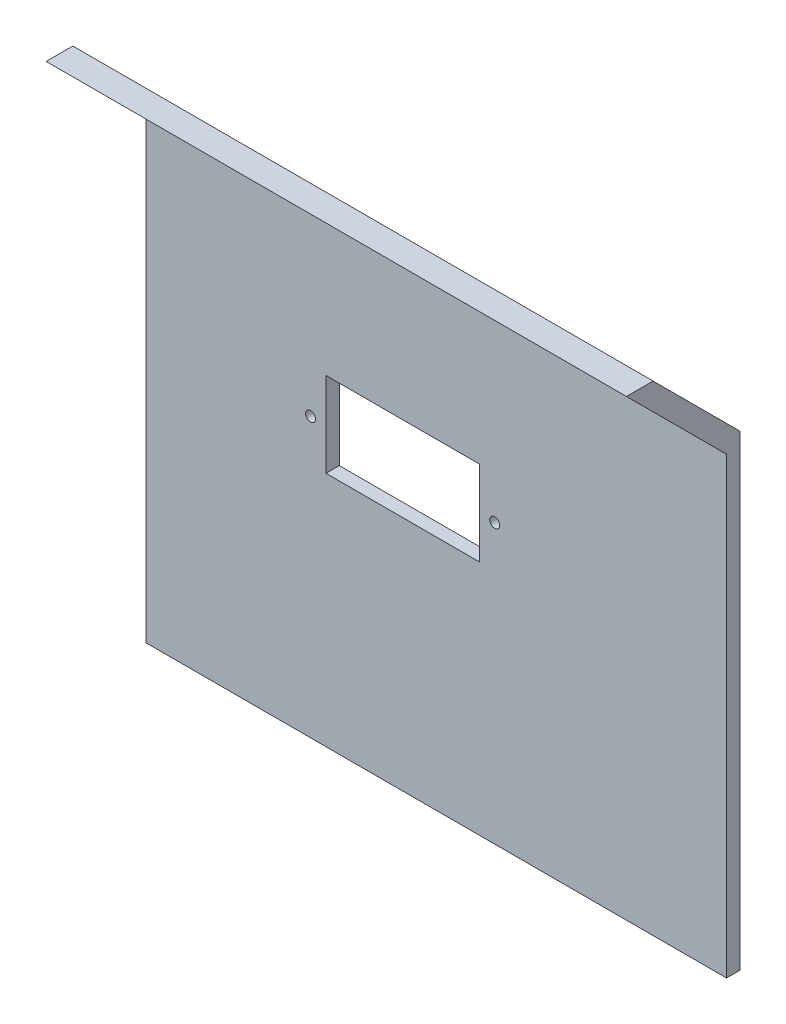
ISO-10303-21;
HEADER;
FILE_DESCRIPTION(('STEP AP214'),'2;1');
FILE_NAME('part.step','',(''),(''),'','','');
FILE_SCHEMA(('AUTOMOTIVE_DESIGN { 1 0 10303 214 1 1 1 1 }'));
ENDSEC;
DATA;
#1=APPLICATION_CONTEXT('core data for automotive mechanical design processes');
#2=APPLICATION_PROTOCOL_DEFINITION('international standard','automotive_design',2000,#1);
#3=PRODUCT_CONTEXT('',#1,'mechanical');
#4=PRODUCT('Part','Part','',(#3));
#5=PRODUCT_RELATED_PRODUCT_CATEGORY('part','',(#4));
#6=PRODUCT_DEFINITION_FORMATION('','',#4);
#7=PRODUCT_DEFINITION_CONTEXT('part definition',#1,'design');
#8=PRODUCT_DEFINITION('design','',#6,#7);
#9=PRODUCT_DEFINITION_SHAPE('','',#8);
#10=(LENGTH_UNIT() NAMED_UNIT(*) SI_UNIT(.MILLI.,.METRE.));
#11=(NAMED_UNIT(*) PLANE_ANGLE_UNIT() SI_UNIT($,.RADIAN.));
#12=(NAMED_UNIT(*) SI_UNIT($,.STERADIAN.) SOLID_ANGLE_UNIT());
#13=UNCERTAINTY_MEASURE_WITH_UNIT(LENGTH_MEASURE(1.E-05),#10,'distance_accuracy_value','');
#14=(GEOMETRIC_REPRESENTATION_CONTEXT(3) GLOBAL_UNCERTAINTY_ASSIGNED_CONTEXT((#13)) GLOBAL_UNIT_ASSIGNED_CONTEXT((#10,
#11,#12)) REPRESENTATION_CONTEXT('',''));
#15=CARTESIAN_POINT('',(0.,0.,0.));
#16=DIRECTION('',(0.,0.,1.));
#17=DIRECTION('',(1.,0.,0.));
#18=AXIS2_PLACEMENT_3D('',#15,#16,#17);
#19=CARTESIAN_POINT('',(-85.,-192.880838161877,2.));
#20=DIRECTION('',(1.,0.,0.));
#21=DIRECTION('',(0.,0.,-1.));
#22=AXIS2_PLACEMENT_3D('',#19,#20,#21);
#23=PLANE('',#22);
#24=DIRECTION('',(0.,-1.,0.));
#25=VECTOR('',#24,1.);
#26=CARTESIAN_POINT('',(-85.,-192.880838161877,2.));
#27=LINE('',#26,#25);
#28=CARTESIAN_POINT('',(-85.,-124.880838161877,2.));
#29=VERTEX_POINT('',#28);
#30=CARTESIAN_POINT('',(-85.,-192.880838161877,2.));
#31=VERTEX_POINT('',#30);
#32=EDGE_CURVE('E223',#29,#31,#27,.T.);
#33=ORIENTED_EDGE('',*,*,#32,.F.);
#34=DIRECTION('',(0.,0.707106781186539,0.707106781186556));
#35=VECTOR('',#34,1.);
#36=CARTESIAN_POINT('',(-85.,-109.880838161877,17.));
#37=LINE('',#36,#35);
#38=CARTESIAN_POINT('',(-85.,-109.880838161877,17.));
#39=VERTEX_POINT('',#38);
#40=EDGE_CURVE('E206',#29,#39,#37,.T.);
#41=ORIENTED_EDGE('',*,*,#40,.T.);
#42=DIRECTION('',(0.,0.,-1.));
#43=VECTOR('',#42,1.);
#44=CARTESIAN_POINT('',(-85.,-109.880838161877,13.));
#45=LINE('',#44,#43);
#46=CARTESIAN_POINT('',(-85.,-109.880838161877,13.));
#47=VERTEX_POINT('',#46);
#48=EDGE_CURVE('E203',#39,#47,#45,.T.);
#49=ORIENTED_EDGE('',*,*,#48,.T.);
#50=DIRECTION('',(0.,-0.707106781186547,-0.707106781186548));
#51=VECTOR('',#50,1.);
#52=CARTESIAN_POINT('',(-85.,-122.880838161877,0.));
#53=LINE('',#52,#51);
#54=CARTESIAN_POINT('',(-85.,-122.880838161877,0.));
#55=VERTEX_POINT('',#54);
#56=EDGE_CURVE('E200',#47,#55,#53,.T.);
#57=ORIENTED_EDGE('',*,*,#56,.T.);
#58=DIRECTION('',(0.,-1.,0.));
#59=VECTOR('',#58,1.);
#60=CARTESIAN_POINT('',(-85.,-192.880838161877,0.));
#61=LINE('',#60,#59);
#62=CARTESIAN_POINT('',(-85.,-192.880838161877,0.));
#63=VERTEX_POINT('',#62);
#64=EDGE_CURVE('E222',#55,#63,#61,.T.);
#65=ORIENTED_EDGE('',*,*,#64,.T.);
#66=DIRECTION('',(0.,0.,-1.));
#67=VECTOR('',#66,1.);
#68=CARTESIAN_POINT('',(-85.,-192.880838161877,2.));
#69=LINE('',#68,#67);
#70=EDGE_CURVE('E241',#31,#63,#69,.T.);
#71=ORIENTED_EDGE('',*,*,#70,.F.);
#72=EDGE_LOOP('',(#33,#41,#49,#57,#65,#71));
#73=FACE_BOUND('',#72,.T.);
#74=ADVANCED_FACE('F36',(#73),#23,.F.);
#75=CARTESIAN_POINT('',(-85.,-192.880838161877,2.));
#76=DIRECTION('',(0.,1.,0.));
#77=DIRECTION('',(0.,0.,1.));
#78=AXIS2_PLACEMENT_3D('',#75,#76,#77);
#79=PLANE('',#78);
#80=DIRECTION('',(1.,0.,0.));
#81=VECTOR('',#80,1.);
#82=CARTESIAN_POINT('',(-85.,-192.880838161877,0.));
#83=LINE('',#82,#81);
#84=CARTESIAN_POINT('',(2.,-192.880838161877,0.));
#85=VERTEX_POINT('',#84);
#86=EDGE_CURVE('E233',#63,#85,#83,.T.);
#87=ORIENTED_EDGE('',*,*,#86,.T.);
#88=DIRECTION('',(0.,0.,-1.));
#89=VECTOR('',#88,1.);
#90=CARTESIAN_POINT('',(2.,-192.880838161877,2.));
#91=LINE('',#90,#89);
#92=CARTESIAN_POINT('',(2.,-192.880838161877,2.));
#93=VERTEX_POINT('',#92);
#94=EDGE_CURVE('E230',#93,#85,#91,.T.);
#95=ORIENTED_EDGE('',*,*,#94,.F.);
#96=DIRECTION('',(1.,0.,0.));
#97=VECTOR('',#96,1.);
#98=CARTESIAN_POINT('',(-85.,-192.880838161877,2.));
#99=LINE('',#98,#97);
#100=EDGE_CURVE('E225',#31,#93,#99,.T.);
#101=ORIENTED_EDGE('',*,*,#100,.F.);
#102=ORIENTED_EDGE('',*,*,#70,.T.);
#103=EDGE_LOOP('',(#87,#95,#101,#102));
#104=FACE_BOUND('',#103,.T.);
#105=ADVANCED_FACE('F287',(#104),#79,.F.);
#106=CARTESIAN_POINT('',(2.,-192.880838161877,2.));
#107=DIRECTION('',(-1.,0.,0.));
#108=DIRECTION('',(0.,0.,1.));
#109=AXIS2_PLACEMENT_3D('',#106,#107,#108);
#110=PLANE('',#109);
#111=DIRECTION('',(0.,1.,0.));
#112=VECTOR('',#111,1.);
#113=CARTESIAN_POINT('',(2.,-192.880838161877,0.));
#114=LINE('',#113,#112);
#115=CARTESIAN_POINT('',(2.,-122.880838161877,0.));
#116=VERTEX_POINT('',#115);
#117=EDGE_CURVE('E235',#85,#116,#114,.T.);
#118=ORIENTED_EDGE('',*,*,#117,.T.);
#119=DIRECTION('',(0.,0.707106781186547,0.707106781186548));
#120=VECTOR('',#119,1.);
#121=CARTESIAN_POINT('',(2.,-122.880838161877,0.));
#122=LINE('',#121,#120);
#123=CARTESIAN_POINT('',(2.,-109.880838161877,13.));
#124=VERTEX_POINT('',#123);
#125=EDGE_CURVE('E212',#116,#124,#122,.T.);
#126=ORIENTED_EDGE('',*,*,#125,.T.);
#127=DIRECTION('',(0.,0.,1.));
#128=VECTOR('',#127,1.);
#129=CARTESIAN_POINT('',(2.,-109.880838161877,13.));
#130=LINE('',#129,#128);
#131=CARTESIAN_POINT('',(2.,-109.880838161877,17.));
#132=VERTEX_POINT('',#131);
#133=EDGE_CURVE('E193',#124,#132,#130,.T.);
#134=ORIENTED_EDGE('',*,*,#133,.T.);
#135=DIRECTION('',(0.,-0.707106781186539,-0.707106781186556));
#136=VECTOR('',#135,1.);
#137=CARTESIAN_POINT('',(2.,-109.880838161877,17.));
#138=LINE('',#137,#136);
#139=CARTESIAN_POINT('',(2.,-124.880838161877,2.));
#140=VERTEX_POINT('',#139);
#141=EDGE_CURVE('E209',#132,#140,#138,.T.);
#142=ORIENTED_EDGE('',*,*,#141,.T.);
#143=DIRECTION('',(0.,1.,0.));
#144=VECTOR('',#143,1.);
#145=CARTESIAN_POINT('',(2.,-192.880838161877,2.));
#146=LINE('',#145,#144);
#147=EDGE_CURVE('E228',#93,#140,#146,.T.);
#148=ORIENTED_EDGE('',*,*,#147,.F.);
#149=ORIENTED_EDGE('',*,*,#94,.T.);
#150=EDGE_LOOP('',(#118,#126,#134,#142,#148,#149));
#151=FACE_BOUND('',#150,.T.);
#152=ADVANCED_FACE('F282',(#151),#110,.F.);
#153=CARTESIAN_POINT('',(0.,0.,2.));
#154=DIRECTION('',(0.,0.,-1.));
#155=DIRECTION('',(-1.,0.,0.));
#156=AXIS2_PLACEMENT_3D('',#153,#154,#155);
#157=PLANE('',#156);
#158=CARTESIAN_POINT('',(-32.7501243548217,-151.130838161877,2.));
#159=DIRECTION('',(0.,0.,1.));
#160=DIRECTION('',(1.,0.,0.));
#161=AXIS2_PLACEMENT_3D('',#158,#159,#160);
#162=CIRCLE('',#161,0.749999999999999);
#163=CARTESIAN_POINT('',(-32.0001243548217,-151.130838161877,2.));
#164=VERTEX_POINT('',#163);
#165=EDGE_CURVE('E173',#164,#164,#162,.T.);
#166=ORIENTED_EDGE('',*,*,#165,.F.);
#167=EDGE_LOOP('',(#166));
#168=FACE_BOUND('',#167,.T.);
#169=CARTESIAN_POINT('',(-60.3501243548217,-151.130838161877,2.));
#170=DIRECTION('',(0.,0.,1.));
#171=DIRECTION('',(1.,0.,0.));
#172=AXIS2_PLACEMENT_3D('',#169,#170,#171);
#173=CIRCLE('',#172,0.749999999999999);
#174=CARTESIAN_POINT('',(-59.6001243548217,-151.130838161877,2.));
#175=VERTEX_POINT('',#174);
#176=EDGE_CURVE('E172',#175,#175,#173,.T.);
#177=ORIENTED_EDGE('',*,*,#176,.F.);
#178=EDGE_LOOP('',(#177));
#179=FACE_BOUND('',#178,.T.);
#180=DIRECTION('',(1.,0.,0.));
#181=VECTOR('',#180,1.);
#182=CARTESIAN_POINT('',(-58.0501243548217,-157.380838161877,2.));
#183=LINE('',#182,#181);
#184=CARTESIAN_POINT('',(-58.0501243548217,-157.380838161877,2.));
#185=VERTEX_POINT('',#184);
#186=CARTESIAN_POINT('',(-35.0501243548217,-157.380838161877,2.));
#187=VERTEX_POINT('',#186);
#188=EDGE_CURVE('E181',#185,#187,#183,.T.);
#189=ORIENTED_EDGE('',*,*,#188,.F.);
#190=DIRECTION('',(0.,-1.,0.));
#191=VECTOR('',#190,1.);
#192=CARTESIAN_POINT('',(-58.0501243548217,-144.680838161877,2.));
#193=LINE('',#192,#191);
#194=CARTESIAN_POINT('',(-58.0501243548217,-144.680838161877,2.));
#195=VERTEX_POINT('',#194);
#196=EDGE_CURVE('E179',#195,#185,#193,.T.);
#197=ORIENTED_EDGE('',*,*,#196,.F.);
#198=DIRECTION('',(-1.,0.,0.));
#199=VECTOR('',#198,1.);
#200=CARTESIAN_POINT('',(-58.0501243548217,-144.680838161877,2.));
#201=LINE('',#200,#199);
#202=CARTESIAN_POINT('',(-35.0501243548217,-144.680838161877,2.));
#203=VERTEX_POINT('',#202);
#204=EDGE_CURVE('E187',#203,#195,#201,.T.);
#205=ORIENTED_EDGE('',*,*,#204,.F.);
#206=DIRECTION('',(0.,1.,0.));
#207=VECTOR('',#206,1.);
#208=CARTESIAN_POINT('',(-35.0501243548217,-144.680838161877,2.));
#209=LINE('',#208,#207);
#210=EDGE_CURVE('E184',#187,#203,#209,.T.);
#211=ORIENTED_EDGE('',*,*,#210,.F.);
#212=EDGE_LOOP('',(#189,#197,#205,#211));
#213=FACE_BOUND('',#212,.T.);
#214=ORIENTED_EDGE('',*,*,#147,.T.);
#215=DIRECTION('',(1.,0.,0.));
#216=VECTOR('',#215,1.);
#217=CARTESIAN_POINT('',(-107.671568097509,-124.880838161877,2.));
#218=LINE('',#217,#216);
#219=EDGE_CURVE('E217',#29,#140,#218,.T.);
#220=ORIENTED_EDGE('',*,*,#219,.F.);
#221=ORIENTED_EDGE('',*,*,#32,.T.);
#222=ORIENTED_EDGE('',*,*,#100,.T.);
#223=EDGE_LOOP('',(#214,#220,#221,#222));
#224=FACE_BOUND('',#223,.T.);
#225=ADVANCED_FACE('F262',(#168,#179,#213,#224),#157,.F.);
#226=CARTESIAN_POINT('',(0.,0.,0.));
#227=DIRECTION('',(0.,0.,-1.));
#228=DIRECTION('',(-1.,0.,0.));
#229=AXIS2_PLACEMENT_3D('',#226,#227,#228);
#230=PLANE('',#229);
#231=CARTESIAN_POINT('',(-32.7501243548217,-151.130838161877,0.));
#232=DIRECTION('',(0.,0.,-1.));
#233=DIRECTION('',(-1.,0.,0.));
#234=AXIS2_PLACEMENT_3D('',#231,#232,#233);
#235=CIRCLE('',#234,0.749999999999999);
#236=CARTESIAN_POINT('',(-32.0001243548217,-151.130838161877,0.));
#237=VERTEX_POINT('',#236);
#238=EDGE_CURVE('E39',#237,#237,#235,.T.);
#239=ORIENTED_EDGE('',*,*,#238,.F.);
#240=EDGE_LOOP('',(#239));
#241=FACE_BOUND('',#240,.T.);
#242=CARTESIAN_POINT('',(-60.3501243548217,-151.130838161877,0.));
#243=DIRECTION('',(0.,0.,-1.));
#244=DIRECTION('',(-1.,0.,0.));
#245=AXIS2_PLACEMENT_3D('',#242,#243,#244);
#246=CIRCLE('',#245,0.749999999999999);
#247=CARTESIAN_POINT('',(-59.6001243548217,-151.130838161877,0.));
#248=VERTEX_POINT('',#247);
#249=EDGE_CURVE('E176',#248,#248,#246,.T.);
#250=ORIENTED_EDGE('',*,*,#249,.F.);
#251=EDGE_LOOP('',(#250));
#252=FACE_BOUND('',#251,.T.);
#253=DIRECTION('',(0.,1.,0.));
#254=VECTOR('',#253,1.);
#255=CARTESIAN_POINT('',(-58.0501243548217,0.,0.));
#256=LINE('',#255,#254);
#257=CARTESIAN_POINT('',(-58.0501243548217,-157.380838161877,0.));
#258=VERTEX_POINT('',#257);
#259=CARTESIAN_POINT('',(-58.0501243548217,-144.680838161877,0.));
#260=VERTEX_POINT('',#259);
#261=EDGE_CURVE('E11',#258,#260,#256,.T.);
#262=ORIENTED_EDGE('',*,*,#261,.F.);
#263=DIRECTION('',(-1.,0.,0.));
#264=VECTOR('',#263,1.);
#265=CARTESIAN_POINT('',(0.,-157.380838161877,0.));
#266=LINE('',#265,#264);
#267=CARTESIAN_POINT('',(-35.0501243548217,-157.380838161877,0.));
#268=VERTEX_POINT('',#267);
#269=EDGE_CURVE('E244',#268,#258,#266,.T.);
#270=ORIENTED_EDGE('',*,*,#269,.F.);
#271=DIRECTION('',(0.,-1.,0.));
#272=VECTOR('',#271,1.);
#273=CARTESIAN_POINT('',(-35.0501243548217,0.,0.));
#274=LINE('',#273,#272);
#275=CARTESIAN_POINT('',(-35.0501243548217,-144.680838161877,0.));
#276=VERTEX_POINT('',#275);
#277=EDGE_CURVE('E246',#276,#268,#274,.T.);
#278=ORIENTED_EDGE('',*,*,#277,.F.);
#279=DIRECTION('',(1.,0.,0.));
#280=VECTOR('',#279,1.);
#281=CARTESIAN_POINT('',(0.,-144.680838161877,0.));
#282=LINE('',#281,#280);
#283=EDGE_CURVE('E44',#260,#276,#282,.T.);
#284=ORIENTED_EDGE('',*,*,#283,.F.);
#285=EDGE_LOOP('',(#262,#270,#278,#284));
#286=FACE_BOUND('',#285,.T.);
#287=ORIENTED_EDGE('',*,*,#64,.F.);
#288=DIRECTION('',(-1.,0.,0.));
#289=VECTOR('',#288,1.);
#290=CARTESIAN_POINT('',(-85.,-122.880838161877,0.));
#291=LINE('',#290,#289);
#292=EDGE_CURVE('E226',#116,#55,#291,.T.);
#293=ORIENTED_EDGE('',*,*,#292,.F.);
#294=ORIENTED_EDGE('',*,*,#117,.F.);
#295=ORIENTED_EDGE('',*,*,#86,.F.);
#296=EDGE_LOOP('',(#287,#293,#294,#295));
#297=FACE_BOUND('',#296,.T.);
#298=ADVANCED_FACE('F258',(#241,#252,#286,#297),#230,.T.);
#299=CARTESIAN_POINT('',(-107.671568097509,-109.880838161877,13.));
#300=DIRECTION('',(0.,1.,0.));
#301=DIRECTION('',(0.,0.,1.));
#302=AXIS2_PLACEMENT_3D('',#299,#300,#301);
#303=PLANE('',#302);
#304=ORIENTED_EDGE('',*,*,#48,.F.);
#305=DIRECTION('',(1.,0.,0.));
#306=VECTOR('',#305,1.);
#307=CARTESIAN_POINT('',(-107.671568097509,-109.880838161877,17.));
#308=LINE('',#307,#306);
#309=EDGE_CURVE('E215',#39,#132,#308,.T.);
#310=ORIENTED_EDGE('',*,*,#309,.T.);
#311=ORIENTED_EDGE('',*,*,#133,.F.);
#312=DIRECTION('',(1.,0.,0.));
#313=VECTOR('',#312,1.);
#314=CARTESIAN_POINT('',(-107.671568097509,-109.880838161877,13.));
#315=LINE('',#314,#313);
#316=EDGE_CURVE('E204',#47,#124,#315,.T.);
#317=ORIENTED_EDGE('',*,*,#316,.F.);
#318=EDGE_LOOP('',(#304,#310,#311,#317));
#319=FACE_BOUND('',#318,.T.);
#320=ADVANCED_FACE('F261',(#319),#303,.T.);
#321=CARTESIAN_POINT('',(-107.671568097509,-122.880838161877,0.));
#322=DIRECTION('',(0.,0.707106781186548,-0.707106781186547));
#323=DIRECTION('',(0.,0.707106781186547,0.707106781186548));
#324=AXIS2_PLACEMENT_3D('',#321,#322,#323);
#325=PLANE('',#324);
#326=CARTESIAN_POINT('',(-51.5,-117.842390528986,5.03844763289146));
#327=DIRECTION('',(0.,0.707106781186548,-0.707106781186547));
#328=DIRECTION('',(0.,0.707106781186547,0.707106781186548));
#329=AXIS2_PLACEMENT_3D('',#326,#327,#328);
#330=CIRCLE('',#329,4.00000000000001);
#331=CARTESIAN_POINT('',(-51.5,-120.670817653732,2.21002050814526));
#332=VERTEX_POINT('',#331);
#333=CARTESIAN_POINT('',(-51.5,-115.01396340424,7.86687475763766));
#334=VERTEX_POINT('',#333);
#335=EDGE_CURVE('E170',#332,#334,#330,.T.);
#336=ORIENTED_EDGE('',*,*,#335,.F.);
#337=DIRECTION('',(-1.,0.,0.));
#338=VECTOR('',#337,1.);
#339=CARTESIAN_POINT('',(-107.671568097509,-120.670817653732,2.21002050814527));
#340=LINE('',#339,#338);
#341=CARTESIAN_POINT('',(-31.5,-120.670817653732,2.21002050814527));
#342=VERTEX_POINT('',#341);
#343=EDGE_CURVE('E163',#342,#332,#340,.T.);
#344=ORIENTED_EDGE('',*,*,#343,.F.);
#345=CARTESIAN_POINT('',(-31.5,-117.842390528986,5.03844763289146));
#346=DIRECTION('',(0.,0.707106781186548,-0.707106781186547));
#347=DIRECTION('',(0.,0.707106781186547,0.707106781186548));
#348=AXIS2_PLACEMENT_3D('',#345,#346,#347);
#349=CIRCLE('',#348,4.00000000000001);
#350=CARTESIAN_POINT('',(-31.5,-115.01396340424,7.86687475763766));
#351=VERTEX_POINT('',#350);
#352=EDGE_CURVE('E143',#351,#342,#349,.T.);
#353=ORIENTED_EDGE('',*,*,#352,.F.);
#354=DIRECTION('',(1.,0.,0.));
#355=VECTOR('',#354,1.);
#356=CARTESIAN_POINT('',(-107.671568097509,-115.01396340424,7.86687475763766));
#357=LINE('',#356,#355);
#358=EDGE_CURVE('E168',#334,#351,#357,.T.);
#359=ORIENTED_EDGE('',*,*,#358,.F.);
#360=EDGE_LOOP('',(#336,#344,#353,#359));
#361=FACE_BOUND('',#360,.T.);
#362=ORIENTED_EDGE('',*,*,#56,.F.);
#363=ORIENTED_EDGE('',*,*,#316,.T.);
#364=ORIENTED_EDGE('',*,*,#125,.F.);
#365=ORIENTED_EDGE('',*,*,#292,.T.);
#366=EDGE_LOOP('',(#362,#363,#364,#365));
#367=FACE_BOUND('',#366,.T.);
#368=ADVANCED_FACE('F279',(#361,#367),#325,.T.);
#369=CARTESIAN_POINT('',(-107.671568097509,-109.880838161877,17.));
#370=DIRECTION('',(0.,-0.707106781186556,0.707106781186539));
#371=DIRECTION('',(0.,-0.707106781186539,-0.707106781186556));
#372=AXIS2_PLACEMENT_3D('',#369,#370,#371);
#373=PLANE('',#372);
#374=CARTESIAN_POINT('',(-51.5,-119.842390528986,7.03844763289137));
#375=DIRECTION('',(0.,-0.707106781186556,0.707106781186539));
#376=DIRECTION('',(0.,-0.707106781186539,-0.707106781186556));
#377=AXIS2_PLACEMENT_3D('',#374,#375,#376);
#378=CIRCLE('',#377,4.00000000000001);
#379=CARTESIAN_POINT('',(-51.5,-117.01396340424,9.8668747576376));
#380=VERTEX_POINT('',#379);
#381=CARTESIAN_POINT('',(-51.5,-122.670817653732,4.2100205081451));
#382=VERTEX_POINT('',#381);
#383=EDGE_CURVE('E60',#380,#382,#378,.T.);
#384=ORIENTED_EDGE('',*,*,#383,.F.);
#385=DIRECTION('',(-1.,0.,0.));
#386=VECTOR('',#385,1.);
#387=CARTESIAN_POINT('',(-51.5,-117.01396340424,9.8668747576376));
#388=LINE('',#387,#386);
#389=CARTESIAN_POINT('',(-31.5,-117.01396340424,9.8668747576376));
#390=VERTEX_POINT('',#389);
#391=EDGE_CURVE('E156',#390,#380,#388,.T.);
#392=ORIENTED_EDGE('',*,*,#391,.F.);
#393=CARTESIAN_POINT('',(-31.5,-119.842390528986,7.03844763289137));
#394=DIRECTION('',(0.,-0.707106781186556,0.707106781186539));
#395=DIRECTION('',(0.,-0.707106781186539,-0.707106781186556));
#396=AXIS2_PLACEMENT_3D('',#393,#394,#395);
#397=CIRCLE('',#396,4.00000000000001);
#398=CARTESIAN_POINT('',(-31.5,-122.670817653732,4.21002050814515));
#399=VERTEX_POINT('',#398);
#400=EDGE_CURVE('E140',#399,#390,#397,.T.);
#401=ORIENTED_EDGE('',*,*,#400,.F.);
#402=DIRECTION('',(1.,0.,0.));
#403=VECTOR('',#402,1.);
#404=CARTESIAN_POINT('',(-51.5,-122.670817653732,4.21002050814515));
#405=LINE('',#404,#403);
#406=EDGE_CURVE('E149',#382,#399,#405,.T.);
#407=ORIENTED_EDGE('',*,*,#406,.F.);
#408=EDGE_LOOP('',(#384,#392,#401,#407));
#409=FACE_BOUND('',#408,.T.);
#410=ORIENTED_EDGE('',*,*,#40,.F.);
#411=ORIENTED_EDGE('',*,*,#219,.T.);
#412=ORIENTED_EDGE('',*,*,#141,.F.);
#413=ORIENTED_EDGE('',*,*,#309,.F.);
#414=EDGE_LOOP('',(#410,#411,#412,#413));
#415=FACE_BOUND('',#414,.T.);
#416=ADVANCED_FACE('F153',(#409,#415),#373,.T.);
#417=CARTESIAN_POINT('',(-58.0501243548217,-144.680838161877,-13.));
#418=DIRECTION('',(-1.,0.,0.));
#419=DIRECTION('',(0.,0.,1.));
#420=AXIS2_PLACEMENT_3D('',#417,#418,#419);
#421=PLANE('',#420);
#422=ORIENTED_EDGE('',*,*,#261,.T.);
#423=DIRECTION('',(0.,0.,1.));
#424=VECTOR('',#423,1.);
#425=CARTESIAN_POINT('',(-58.0501243548217,-144.680838161877,-13.));
#426=LINE('',#425,#424);
#427=EDGE_CURVE('E191',#260,#195,#426,.T.);
#428=ORIENTED_EDGE('',*,*,#427,.T.);
#429=ORIENTED_EDGE('',*,*,#196,.T.);
#430=DIRECTION('',(0.,0.,1.));
#431=VECTOR('',#430,1.);
#432=CARTESIAN_POINT('',(-58.0501243548217,-157.380838161877,-13.));
#433=LINE('',#432,#431);
#434=EDGE_CURVE('E190',#258,#185,#433,.T.);
#435=ORIENTED_EDGE('',*,*,#434,.F.);
#436=EDGE_LOOP('',(#422,#428,#429,#435));
#437=FACE_BOUND('',#436,.T.);
#438=ADVANCED_FACE('F326',(#437),#421,.F.);
#439=CARTESIAN_POINT('',(-58.0501243548217,-144.680838161877,-13.));
#440=DIRECTION('',(0.,1.,0.));
#441=DIRECTION('',(0.,0.,1.));
#442=AXIS2_PLACEMENT_3D('',#439,#440,#441);
#443=PLANE('',#442);
#444=ORIENTED_EDGE('',*,*,#283,.T.);
#445=DIRECTION('',(0.,0.,1.));
#446=VECTOR('',#445,1.);
#447=CARTESIAN_POINT('',(-35.0501243548217,-144.680838161877,-13.));
#448=LINE('',#447,#446);
#449=EDGE_CURVE('E194',#276,#203,#448,.T.);
#450=ORIENTED_EDGE('',*,*,#449,.T.);
#451=ORIENTED_EDGE('',*,*,#204,.T.);
#452=ORIENTED_EDGE('',*,*,#427,.F.);
#453=EDGE_LOOP('',(#444,#450,#451,#452));
#454=FACE_BOUND('',#453,.T.);
#455=ADVANCED_FACE('F329',(#454),#443,.F.);
#456=CARTESIAN_POINT('',(-35.0501243548217,-144.680838161877,-13.));
#457=DIRECTION('',(1.,0.,0.));
#458=DIRECTION('',(0.,0.,-1.));
#459=AXIS2_PLACEMENT_3D('',#456,#457,#458);
#460=PLANE('',#459);
#461=ORIENTED_EDGE('',*,*,#277,.T.);
#462=DIRECTION('',(0.,0.,1.));
#463=VECTOR('',#462,1.);
#464=CARTESIAN_POINT('',(-35.0501243548217,-157.380838161877,-13.));
#465=LINE('',#464,#463);
#466=EDGE_CURVE('E196',#268,#187,#465,.T.);
#467=ORIENTED_EDGE('',*,*,#466,.T.);
#468=ORIENTED_EDGE('',*,*,#210,.T.);
#469=ORIENTED_EDGE('',*,*,#449,.F.);
#470=EDGE_LOOP('',(#461,#467,#468,#469));
#471=FACE_BOUND('',#470,.T.);
#472=ADVANCED_FACE('F333',(#471),#460,.F.);
#473=CARTESIAN_POINT('',(-58.0501243548217,-157.380838161877,-13.));
#474=DIRECTION('',(0.,-1.,0.));
#475=DIRECTION('',(0.,0.,-1.));
#476=AXIS2_PLACEMENT_3D('',#473,#474,#475);
#477=PLANE('',#476);
#478=ORIENTED_EDGE('',*,*,#269,.T.);
#479=ORIENTED_EDGE('',*,*,#434,.T.);
#480=ORIENTED_EDGE('',*,*,#188,.T.);
#481=ORIENTED_EDGE('',*,*,#466,.F.);
#482=EDGE_LOOP('',(#478,#479,#480,#481));
#483=FACE_BOUND('',#482,.T.);
#484=ADVANCED_FACE('F323',(#483),#477,.F.);
#485=CARTESIAN_POINT('',(-60.3501243548217,-151.130838161877,-13.));
#486=DIRECTION('',(0.,0.,1.));
#487=DIRECTION('',(1.,0.,0.));
#488=AXIS2_PLACEMENT_3D('',#485,#486,#487);
#489=CYLINDRICAL_SURFACE('',#488,0.749999999999999);
#490=CARTESIAN_POINT('',(-59.6001243548217,-151.130838161877,0.));
#491=CARTESIAN_POINT('',(-59.6001243548217,-151.130838161877,0.0208333333333351));
#492=CARTESIAN_POINT('',(-59.6001243548217,-151.130838161877,0.0416666666666684));
#493=CARTESIAN_POINT('',(-59.6001243548217,-151.130838161877,0.0833333333333352));
#494=CARTESIAN_POINT('',(-59.6001243548217,-151.130838161877,0.104166666666669));
#495=CARTESIAN_POINT('',(-59.6001243548217,-151.130838161877,0.145833333333335));
#496=CARTESIAN_POINT('',(-59.6001243548217,-151.130838161877,0.166666666666669));
#497=CARTESIAN_POINT('',(-59.6001243548217,-151.130838161877,0.208333333333335));
#498=CARTESIAN_POINT('',(-59.6001243548217,-151.130838161877,0.229166666666669));
#499=CARTESIAN_POINT('',(-59.6001243548217,-151.130838161877,0.270833333333335));
#500=CARTESIAN_POINT('',(-59.6001243548217,-151.130838161877,0.291666666666669));
#501=CARTESIAN_POINT('',(-59.6001243548217,-151.130838161877,0.333333333333335));
#502=CARTESIAN_POINT('',(-59.6001243548217,-151.130838161877,0.354166666666669));
#503=CARTESIAN_POINT('',(-59.6001243548217,-151.130838161877,0.395833333333335));
#504=CARTESIAN_POINT('',(-59.6001243548217,-151.130838161877,0.416666666666669));
#505=CARTESIAN_POINT('',(-59.6001243548217,-151.130838161877,0.458333333333335));
#506=CARTESIAN_POINT('',(-59.6001243548217,-151.130838161877,0.479166666666669));
#507=CARTESIAN_POINT('',(-59.6001243548217,-151.130838161877,0.520833333333335));
#508=CARTESIAN_POINT('',(-59.6001243548217,-151.130838161877,0.541666666666668));
#509=CARTESIAN_POINT('',(-59.6001243548217,-151.130838161877,0.583333333333334));
#510=CARTESIAN_POINT('',(-59.6001243548217,-151.130838161877,0.604166666666667));
#511=CARTESIAN_POINT('',(-59.6001243548217,-151.130838161877,0.645833333333334));
#512=CARTESIAN_POINT('',(-59.6001243548217,-151.130838161877,0.666666666666667));
#513=CARTESIAN_POINT('',(-59.6001243548217,-151.130838161877,0.708333333333334));
#514=CARTESIAN_POINT('',(-59.6001243548217,-151.130838161877,0.729166666666667));
#515=CARTESIAN_POINT('',(-59.6001243548217,-151.130838161877,0.770833333333334));
#516=CARTESIAN_POINT('',(-59.6001243548217,-151.130838161877,0.791666666666667));
#517=CARTESIAN_POINT('',(-59.6001243548217,-151.130838161877,0.833333333333334));
#518=CARTESIAN_POINT('',(-59.6001243548217,-151.130838161877,0.854166666666667));
#519=CARTESIAN_POINT('',(-59.6001243548217,-151.130838161877,0.895833333333334));
#520=CARTESIAN_POINT('',(-59.6001243548217,-151.130838161877,0.916666666666668));
#521=CARTESIAN_POINT('',(-59.6001243548217,-151.130838161877,0.958333333333334));
#522=CARTESIAN_POINT('',(-59.6001243548217,-151.130838161877,0.979166666666668));
#523=CARTESIAN_POINT('',(-59.6001243548217,-151.130838161877,1.02083333333333));
#524=CARTESIAN_POINT('',(-59.6001243548217,-151.130838161877,1.04166666666667));
#525=CARTESIAN_POINT('',(-59.6001243548217,-151.130838161877,1.08333333333333));
#526=CARTESIAN_POINT('',(-59.6001243548217,-151.130838161877,1.10416666666667));
#527=CARTESIAN_POINT('',(-59.6001243548217,-151.130838161877,1.14583333333333));
#528=CARTESIAN_POINT('',(-59.6001243548217,-151.130838161877,1.16666666666667));
#529=CARTESIAN_POINT('',(-59.6001243548217,-151.130838161877,1.20833333333333));
#530=CARTESIAN_POINT('',(-59.6001243548217,-151.130838161877,1.22916666666667));
#531=CARTESIAN_POINT('',(-59.6001243548217,-151.130838161877,1.27083333333333));
#532=CARTESIAN_POINT('',(-59.6001243548217,-151.130838161877,1.29166666666667));
#533=CARTESIAN_POINT('',(-59.6001243548217,-151.130838161877,1.33333333333333));
#534=CARTESIAN_POINT('',(-59.6001243548217,-151.130838161877,1.35416666666667));
#535=CARTESIAN_POINT('',(-59.6001243548217,-151.130838161877,1.39583333333333));
#536=CARTESIAN_POINT('',(-59.6001243548217,-151.130838161877,1.41666666666667));
#537=CARTESIAN_POINT('',(-59.6001243548217,-151.130838161877,1.45833333333333));
#538=CARTESIAN_POINT('',(-59.6001243548217,-151.130838161877,1.47916666666667));
#539=CARTESIAN_POINT('',(-59.6001243548217,-151.130838161877,1.52083333333333));
#540=CARTESIAN_POINT('',(-59.6001243548217,-151.130838161877,1.54166666666667));
#541=CARTESIAN_POINT('',(-59.6001243548217,-151.130838161877,1.58333333333333));
#542=CARTESIAN_POINT('',(-59.6001243548217,-151.130838161877,1.60416666666667));
#543=CARTESIAN_POINT('',(-59.6001243548217,-151.130838161877,1.64583333333333));
#544=CARTESIAN_POINT('',(-59.6001243548217,-151.130838161877,1.66666666666667));
#545=CARTESIAN_POINT('',(-59.6001243548217,-151.130838161877,1.70833333333333));
#546=CARTESIAN_POINT('',(-59.6001243548217,-151.130838161877,1.72916666666667));
#547=CARTESIAN_POINT('',(-59.6001243548217,-151.130838161877,1.77083333333333));
#548=CARTESIAN_POINT('',(-59.6001243548217,-151.130838161877,1.79166666666667));
#549=CARTESIAN_POINT('',(-59.6001243548217,-151.130838161877,1.83333333333333));
#550=CARTESIAN_POINT('',(-59.6001243548217,-151.130838161877,1.85416666666667));
#551=CARTESIAN_POINT('',(-59.6001243548217,-151.130838161877,1.89583333333333));
#552=CARTESIAN_POINT('',(-59.6001243548217,-151.130838161877,1.91666666666667));
#553=CARTESIAN_POINT('',(-59.6001243548217,-151.130838161877,1.95833333333333));
#554=CARTESIAN_POINT('',(-59.6001243548217,-151.130838161877,1.97916666666667));
#555=CARTESIAN_POINT('',(-59.6001243548217,-151.130838161877,2.));
#556=B_SPLINE_CURVE_WITH_KNOTS('',3,(#490,#491,#492,#493,#494,#495,#496,#497,#498,#499,#500,
#501,#502,#503,#504,#505,#506,#507,#508,#509,#510,#511,#512,#513,#514,#515,#516,#517,#518,#519,
#520,#521,#522,#523,#524,#525,#526,#527,#528,#529,#530,#531,#532,#533,#534,#535,#536,#537,#538,
#539,#540,#541,#542,#543,#544,#545,#546,#547,#548,#549,#550,#551,#552,#553,#554,#555),
.UNSPECIFIED.,.F.,.F.,(4,2,2,2,2,2,2,2,2,2,2,2,2,2,2,2,2,2,2,2,2,2,2,2,2,2,2,2,2,2,2,2,4),(0.,
0.0625000000000001,0.125,0.1875,0.25,0.3125,0.375,0.4375,0.5,0.562499999999999,
0.624999999999999,0.687499999999999,0.749999999999999,0.812499999999999,0.874999999999999,
0.937499999999999,0.999999999999999,1.0625,1.125,1.1875,1.25,1.3125,1.375,1.4375,1.5,1.5625,
1.625,1.6875,1.75,1.8125,1.875,1.9375,2.),.UNSPECIFIED.);
#557=EDGE_CURVE('BSEAM340',#248,#175,#556,.T.);
#558=ORIENTED_EDGE('',*,*,#249,.T.);
#559=ORIENTED_EDGE('',*,*,#176,.T.);
#560=ORIENTED_EDGE('',*,*,#557,.T.);
#561=ORIENTED_EDGE('',*,*,#557,.F.);
#562=EDGE_LOOP('',(#558,#560,#559,#561));
#563=FACE_BOUND('',#562,.T.);
#564=ADVANCED_FACE('F340',(#563),#489,.F.);
#565=CARTESIAN_POINT('',(-32.7501243548217,-151.130838161877,-13.));
#566=DIRECTION('',(0.,0.,1.));
#567=DIRECTION('',(1.,0.,0.));
#568=AXIS2_PLACEMENT_3D('',#565,#566,#567);
#569=CYLINDRICAL_SURFACE('',#568,0.749999999999999);
#570=CARTESIAN_POINT('',(-32.0001243548217,-151.130838161877,0.));
#571=CARTESIAN_POINT('',(-32.0001243548217,-151.130838161877,0.0208333333333351));
#572=CARTESIAN_POINT('',(-32.0001243548217,-151.130838161877,0.0416666666666684));
#573=CARTESIAN_POINT('',(-32.0001243548217,-151.130838161877,0.0833333333333352));
#574=CARTESIAN_POINT('',(-32.0001243548217,-151.130838161877,0.104166666666669));
#575=CARTESIAN_POINT('',(-32.0001243548217,-151.130838161877,0.145833333333335));
#576=CARTESIAN_POINT('',(-32.0001243548217,-151.130838161877,0.166666666666669));
#577=CARTESIAN_POINT('',(-32.0001243548217,-151.130838161877,0.208333333333335));
#578=CARTESIAN_POINT('',(-32.0001243548217,-151.130838161877,0.229166666666669));
#579=CARTESIAN_POINT('',(-32.0001243548217,-151.130838161877,0.270833333333335));
#580=CARTESIAN_POINT('',(-32.0001243548217,-151.130838161877,0.291666666666669));
#581=CARTESIAN_POINT('',(-32.0001243548217,-151.130838161877,0.333333333333335));
#582=CARTESIAN_POINT('',(-32.0001243548217,-151.130838161877,0.354166666666669));
#583=CARTESIAN_POINT('',(-32.0001243548217,-151.130838161877,0.395833333333335));
#584=CARTESIAN_POINT('',(-32.0001243548217,-151.130838161877,0.416666666666669));
#585=CARTESIAN_POINT('',(-32.0001243548217,-151.130838161877,0.458333333333335));
#586=CARTESIAN_POINT('',(-32.0001243548217,-151.130838161877,0.479166666666669));
#587=CARTESIAN_POINT('',(-32.0001243548217,-151.130838161877,0.520833333333335));
#588=CARTESIAN_POINT('',(-32.0001243548217,-151.130838161877,0.541666666666668));
#589=CARTESIAN_POINT('',(-32.0001243548217,-151.130838161877,0.583333333333334));
#590=CARTESIAN_POINT('',(-32.0001243548217,-151.130838161877,0.604166666666667));
#591=CARTESIAN_POINT('',(-32.0001243548217,-151.130838161877,0.645833333333334));
#592=CARTESIAN_POINT('',(-32.0001243548217,-151.130838161877,0.666666666666667));
#593=CARTESIAN_POINT('',(-32.0001243548217,-151.130838161877,0.708333333333334));
#594=CARTESIAN_POINT('',(-32.0001243548217,-151.130838161877,0.729166666666667));
#595=CARTESIAN_POINT('',(-32.0001243548217,-151.130838161877,0.770833333333334));
#596=CARTESIAN_POINT('',(-32.0001243548217,-151.130838161877,0.791666666666667));
#597=CARTESIAN_POINT('',(-32.0001243548217,-151.130838161877,0.833333333333334));
#598=CARTESIAN_POINT('',(-32.0001243548217,-151.130838161877,0.854166666666667));
#599=CARTESIAN_POINT('',(-32.0001243548217,-151.130838161877,0.895833333333334));
#600=CARTESIAN_POINT('',(-32.0001243548217,-151.130838161877,0.916666666666668));
#601=CARTESIAN_POINT('',(-32.0001243548217,-151.130838161877,0.958333333333334));
#602=CARTESIAN_POINT('',(-32.0001243548217,-151.130838161877,0.979166666666668));
#603=CARTESIAN_POINT('',(-32.0001243548217,-151.130838161877,1.02083333333333));
#604=CARTESIAN_POINT('',(-32.0001243548217,-151.130838161877,1.04166666666667));
#605=CARTESIAN_POINT('',(-32.0001243548217,-151.130838161877,1.08333333333333));
#606=CARTESIAN_POINT('',(-32.0001243548217,-151.130838161877,1.10416666666667));
#607=CARTESIAN_POINT('',(-32.0001243548217,-151.130838161877,1.14583333333333));
#608=CARTESIAN_POINT('',(-32.0001243548217,-151.130838161877,1.16666666666667));
#609=CARTESIAN_POINT('',(-32.0001243548217,-151.130838161877,1.20833333333333));
#610=CARTESIAN_POINT('',(-32.0001243548217,-151.130838161877,1.22916666666667));
#611=CARTESIAN_POINT('',(-32.0001243548217,-151.130838161877,1.27083333333333));
#612=CARTESIAN_POINT('',(-32.0001243548217,-151.130838161877,1.29166666666667));
#613=CARTESIAN_POINT('',(-32.0001243548217,-151.130838161877,1.33333333333333));
#614=CARTESIAN_POINT('',(-32.0001243548217,-151.130838161877,1.35416666666667));
#615=CARTESIAN_POINT('',(-32.0001243548217,-151.130838161877,1.39583333333333));
#616=CARTESIAN_POINT('',(-32.0001243548217,-151.130838161877,1.41666666666667));
#617=CARTESIAN_POINT('',(-32.0001243548217,-151.130838161877,1.45833333333333));
#618=CARTESIAN_POINT('',(-32.0001243548217,-151.130838161877,1.47916666666667));
#619=CARTESIAN_POINT('',(-32.0001243548217,-151.130838161877,1.52083333333333));
#620=CARTESIAN_POINT('',(-32.0001243548217,-151.130838161877,1.54166666666667));
#621=CARTESIAN_POINT('',(-32.0001243548217,-151.130838161877,1.58333333333333));
#622=CARTESIAN_POINT('',(-32.0001243548217,-151.130838161877,1.60416666666667));
#623=CARTESIAN_POINT('',(-32.0001243548217,-151.130838161877,1.64583333333333));
#624=CARTESIAN_POINT('',(-32.0001243548217,-151.130838161877,1.66666666666667));
#625=CARTESIAN_POINT('',(-32.0001243548217,-151.130838161877,1.70833333333333));
#626=CARTESIAN_POINT('',(-32.0001243548217,-151.130838161877,1.72916666666667));
#627=CARTESIAN_POINT('',(-32.0001243548217,-151.130838161877,1.77083333333333));
#628=CARTESIAN_POINT('',(-32.0001243548217,-151.130838161877,1.79166666666667));
#629=CARTESIAN_POINT('',(-32.0001243548217,-151.130838161877,1.83333333333333));
#630=CARTESIAN_POINT('',(-32.0001243548217,-151.130838161877,1.85416666666667));
#631=CARTESIAN_POINT('',(-32.0001243548217,-151.130838161877,1.89583333333333));
#632=CARTESIAN_POINT('',(-32.0001243548217,-151.130838161877,1.91666666666667));
#633=CARTESIAN_POINT('',(-32.0001243548217,-151.130838161877,1.95833333333333));
#634=CARTESIAN_POINT('',(-32.0001243548217,-151.130838161877,1.97916666666667));
#635=CARTESIAN_POINT('',(-32.0001243548217,-151.130838161877,2.));
#636=B_SPLINE_CURVE_WITH_KNOTS('',3,(#570,#571,#572,#573,#574,#575,#576,#577,#578,#579,#580,
#581,#582,#583,#584,#585,#586,#587,#588,#589,#590,#591,#592,#593,#594,#595,#596,#597,#598,#599,
#600,#601,#602,#603,#604,#605,#606,#607,#608,#609,#610,#611,#612,#613,#614,#615,#616,#617,#618,
#619,#620,#621,#622,#623,#624,#625,#626,#627,#628,#629,#630,#631,#632,#633,#634,#635),
.UNSPECIFIED.,.F.,.F.,(4,2,2,2,2,2,2,2,2,2,2,2,2,2,2,2,2,2,2,2,2,2,2,2,2,2,2,2,2,2,2,2,4),(0.,
0.0625000000000001,0.125,0.1875,0.25,0.3125,0.375,0.4375,0.5,0.562499999999999,
0.624999999999999,0.687499999999999,0.749999999999999,0.812499999999999,0.874999999999999,
0.937499999999999,0.999999999999999,1.0625,1.125,1.1875,1.25,1.3125,1.375,1.4375,1.5,1.5625,
1.625,1.6875,1.75,1.8125,1.875,1.9375,2.),.UNSPECIFIED.);
#637=EDGE_CURVE('BSEAM255',#237,#164,#636,.T.);
#638=ORIENTED_EDGE('',*,*,#238,.T.);
#639=ORIENTED_EDGE('',*,*,#165,.T.);
#640=ORIENTED_EDGE('',*,*,#637,.T.);
#641=ORIENTED_EDGE('',*,*,#637,.F.);
#642=EDGE_LOOP('',(#638,#640,#639,#641));
#643=FACE_BOUND('',#642,.T.);
#644=ADVANCED_FACE('F255',(#643),#569,.F.);
#645=CARTESIAN_POINT('',(-51.5,-116.306856623053,3.50291372695868));
#646=DIRECTION('',(0.,-0.707106781186556,0.707106781186539));
#647=DIRECTION('',(0.,-0.707106781186539,-0.707106781186556));
#648=AXIS2_PLACEMENT_3D('',#645,#646,#647);
#649=CYLINDRICAL_SURFACE('',#648,4.00000000000001);
#650=ORIENTED_EDGE('',*,*,#335,.T.);
#651=DIRECTION('',(0.,-0.707106781186556,0.707106781186539));
#652=VECTOR('',#651,1.);
#653=CARTESIAN_POINT('',(-51.5,-113.478429498307,6.33134085170491));
#654=LINE('',#653,#652);
#655=EDGE_CURVE('E161',#334,#380,#654,.T.);
#656=ORIENTED_EDGE('',*,*,#655,.T.);
#657=ORIENTED_EDGE('',*,*,#383,.T.);
#658=DIRECTION('',(0.,-0.707106781186556,0.707106781186539));
#659=VECTOR('',#658,1.);
#660=CARTESIAN_POINT('',(-51.5,-119.135283747799,0.67448660221245));
#661=LINE('',#660,#659);
#662=EDGE_CURVE('E146',#332,#382,#661,.T.);
#663=ORIENTED_EDGE('',*,*,#662,.F.);
#664=EDGE_LOOP('',(#650,#656,#657,#663));
#665=FACE_BOUND('',#664,.T.);
#666=ADVANCED_FACE('F398',(#665),#649,.F.);
#667=CARTESIAN_POINT('',(-51.5,-113.478429498307,6.33134085170491));
#668=DIRECTION('',(0.,0.707106781186539,0.707106781186556));
#669=DIRECTION('',(0.,-0.707106781186556,0.707106781186539));
#670=AXIS2_PLACEMENT_3D('',#667,#668,#669);
#671=PLANE('',#670);
#672=ORIENTED_EDGE('',*,*,#358,.T.);
#673=DIRECTION('',(0.,-0.707106781186556,0.707106781186539));
#674=VECTOR('',#673,1.);
#675=CARTESIAN_POINT('',(-31.5,-113.478429498307,6.33134085170491));
#676=LINE('',#675,#674);
#677=EDGE_CURVE('E145',#351,#390,#676,.T.);
#678=ORIENTED_EDGE('',*,*,#677,.T.);
#679=ORIENTED_EDGE('',*,*,#391,.T.);
#680=ORIENTED_EDGE('',*,*,#655,.F.);
#681=EDGE_LOOP('',(#672,#678,#679,#680));
#682=FACE_BOUND('',#681,.T.);
#683=ADVANCED_FACE('F417',(#682),#671,.F.);
#684=CARTESIAN_POINT('',(-31.5,-116.306856623053,3.50291372695868));
#685=DIRECTION('',(0.,-0.707106781186556,0.707106781186539));
#686=DIRECTION('',(0.,-0.707106781186539,-0.707106781186556));
#687=AXIS2_PLACEMENT_3D('',#684,#685,#686);
#688=CYLINDRICAL_SURFACE('',#687,4.00000000000001);
#689=ORIENTED_EDGE('',*,*,#352,.T.);
#690=DIRECTION('',(0.,-0.707106781186556,0.707106781186539));
#691=VECTOR('',#690,1.);
#692=CARTESIAN_POINT('',(-31.5,-119.135283747799,0.674486602212451));
#693=LINE('',#692,#691);
#694=EDGE_CURVE('E52',#342,#399,#693,.T.);
#695=ORIENTED_EDGE('',*,*,#694,.T.);
#696=ORIENTED_EDGE('',*,*,#400,.T.);
#697=ORIENTED_EDGE('',*,*,#677,.F.);
#698=EDGE_LOOP('',(#689,#695,#696,#697));
#699=FACE_BOUND('',#698,.T.);
#700=ADVANCED_FACE('F137',(#699),#688,.F.);
#701=CARTESIAN_POINT('',(-51.5,-119.135283747799,0.67448660221245));
#702=DIRECTION('',(0.,-0.707106781186539,-0.707106781186556));
#703=DIRECTION('',(0.,0.707106781186556,-0.707106781186539));
#704=AXIS2_PLACEMENT_3D('',#701,#702,#703);
#705=PLANE('',#704);
#706=ORIENTED_EDGE('',*,*,#343,.T.);
#707=ORIENTED_EDGE('',*,*,#662,.T.);
#708=ORIENTED_EDGE('',*,*,#406,.T.);
#709=ORIENTED_EDGE('',*,*,#694,.F.);
#710=EDGE_LOOP('',(#706,#707,#708,#709));
#711=FACE_BOUND('',#710,.T.);
#712=ADVANCED_FACE('F150',(#711),#705,.F.);
#713=CLOSED_SHELL('',(#74,#105,#152,#225,#298,#320,#368,#416,#438,#455,#472,#484,#564,#644,#666,
#683,#700,#712));
#714=MANIFOLD_SOLID_BREP('B2',#713);
#715=ADVANCED_BREP_SHAPE_REPRESENTATION('',(#18,#714),#14);
#716=SHAPE_DEFINITION_REPRESENTATION(#9,#715);
ENDSEC;
END-ISO-10303-21;
